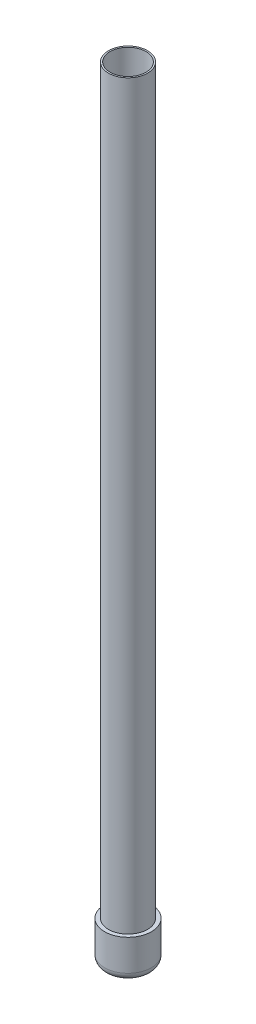
ISO-10303-21;
HEADER;
FILE_DESCRIPTION(('STEP AP214'),'2;1');
FILE_NAME('part.step','',(''),(''),'','','');
FILE_SCHEMA(('AUTOMOTIVE_DESIGN { 1 0 10303 214 1 1 1 1 }'));
ENDSEC;
DATA;
#1=APPLICATION_CONTEXT('core data for automotive mechanical design processes');
#2=APPLICATION_PROTOCOL_DEFINITION('international standard','automotive_design',2000,#1);
#3=PRODUCT_CONTEXT('',#1,'mechanical');
#4=PRODUCT('Part','Part','',(#3));
#5=PRODUCT_RELATED_PRODUCT_CATEGORY('part','',(#4));
#6=PRODUCT_DEFINITION_FORMATION('','',#4);
#7=PRODUCT_DEFINITION_CONTEXT('part definition',#1,'design');
#8=PRODUCT_DEFINITION('design','',#6,#7);
#9=PRODUCT_DEFINITION_SHAPE('','',#8);
#10=(LENGTH_UNIT() NAMED_UNIT(*) SI_UNIT(.MILLI.,.METRE.));
#11=(NAMED_UNIT(*) PLANE_ANGLE_UNIT() SI_UNIT($,.RADIAN.));
#12=(NAMED_UNIT(*) SI_UNIT($,.STERADIAN.) SOLID_ANGLE_UNIT());
#13=UNCERTAINTY_MEASURE_WITH_UNIT(LENGTH_MEASURE(1.E-05),#10,'distance_accuracy_value','');
#14=(GEOMETRIC_REPRESENTATION_CONTEXT(3) GLOBAL_UNCERTAINTY_ASSIGNED_CONTEXT((#13)) GLOBAL_UNIT_ASSIGNED_CONTEXT((#10,
#11,#12)) REPRESENTATION_CONTEXT('',''));
#15=CARTESIAN_POINT('',(0.,0.,0.));
#16=DIRECTION('',(0.,0.,1.));
#17=DIRECTION('',(1.,0.,0.));
#18=AXIS2_PLACEMENT_3D('',#15,#16,#17);
#19=CARTESIAN_POINT('',(0.,500.,0.));
#20=DIRECTION('',(0.,-1.,0.));
#21=DIRECTION('',(0.,0.,-1.));
#22=AXIS2_PLACEMENT_3D('',#19,#20,#21);
#23=CYLINDRICAL_SURFACE('',#22,12.5);
#24=CARTESIAN_POINT('',(0.,500.,0.));
#25=DIRECTION('',(0.,1.,0.));
#26=DIRECTION('',(0.,0.,1.));
#27=AXIS2_PLACEMENT_3D('',#24,#25,#26);
#28=CIRCLE('',#27,12.5);
#29=CARTESIAN_POINT('',(0.,500.,12.5));
#30=VERTEX_POINT('',#29);
#31=EDGE_CURVE('E46',#30,#30,#28,.T.);
#32=ORIENTED_EDGE('',*,*,#31,.F.);
#33=EDGE_LOOP('',(#32));
#34=FACE_BOUND('',#33,.T.);
#35=CARTESIAN_POINT('',(0.,25.,0.));
#36=DIRECTION('',(0.,-1.,0.));
#37=DIRECTION('',(0.,0.,-1.));
#38=AXIS2_PLACEMENT_3D('',#35,#36,#37);
#39=CIRCLE('',#38,12.5);
#40=CARTESIAN_POINT('',(0.,25.,-12.5));
#41=VERTEX_POINT('',#40);
#42=EDGE_CURVE('E42',#41,#41,#39,.T.);
#43=ORIENTED_EDGE('',*,*,#42,.F.);
#44=EDGE_LOOP('',(#43));
#45=FACE_BOUND('',#44,.T.);
#46=ADVANCED_FACE('F31',(#34,#45),#23,.T.);
#47=CARTESIAN_POINT('',(0.,500.,0.));
#48=DIRECTION('',(0.,1.,0.));
#49=DIRECTION('',(0.,0.,1.));
#50=AXIS2_PLACEMENT_3D('',#47,#48,#49);
#51=PLANE('',#50);
#52=CARTESIAN_POINT('',(0.,500.,0.));
#53=DIRECTION('',(0.,1.,0.));
#54=DIRECTION('',(0.,0.,1.));
#55=AXIS2_PLACEMENT_3D('',#52,#53,#54);
#56=CIRCLE('',#55,11.5);
#57=CARTESIAN_POINT('',(0.,500.,11.5));
#58=VERTEX_POINT('',#57);
#59=EDGE_CURVE('E55',#58,#58,#56,.T.);
#60=ORIENTED_EDGE('',*,*,#59,.F.);
#61=EDGE_LOOP('',(#60));
#62=FACE_BOUND('',#61,.T.);
#63=ORIENTED_EDGE('',*,*,#31,.T.);
#64=EDGE_LOOP('',(#63));
#65=FACE_BOUND('',#64,.T.);
#66=ADVANCED_FACE('F90',(#62,#65),#51,.T.);
#67=CARTESIAN_POINT('',(0.,25.,0.));
#68=DIRECTION('',(0.,-1.,0.));
#69=DIRECTION('',(0.,0.,-1.));
#70=AXIS2_PLACEMENT_3D('',#67,#68,#69);
#71=CYLINDRICAL_SURFACE('',#70,15.);
#72=CARTESIAN_POINT('',(0.,5.,0.));
#73=DIRECTION('',(0.,1.,0.));
#74=DIRECTION('',(0.,0.,1.));
#75=AXIS2_PLACEMENT_3D('',#72,#73,#74);
#76=CIRCLE('',#75,15.);
#77=CARTESIAN_POINT('',(0.,5.,15.));
#78=VERTEX_POINT('',#77);
#79=EDGE_CURVE('E10',#78,#78,#76,.T.);
#80=ORIENTED_EDGE('',*,*,#79,.T.);
#81=EDGE_LOOP('',(#80));
#82=FACE_BOUND('',#81,.T.);
#83=CARTESIAN_POINT('',(0.,25.,0.));
#84=DIRECTION('',(0.,-1.,0.));
#85=DIRECTION('',(0.,0.,-1.));
#86=AXIS2_PLACEMENT_3D('',#83,#84,#85);
#87=CIRCLE('',#86,15.);
#88=CARTESIAN_POINT('',(0.,25.,-15.));
#89=VERTEX_POINT('',#88);
#90=EDGE_CURVE('E51',#89,#89,#87,.T.);
#91=ORIENTED_EDGE('',*,*,#90,.T.);
#92=EDGE_LOOP('',(#91));
#93=FACE_BOUND('',#92,.T.);
#94=ADVANCED_FACE('F95',(#82,#93),#71,.T.);
#95=CARTESIAN_POINT('',(0.,25.,0.));
#96=DIRECTION('',(0.,-1.,0.));
#97=DIRECTION('',(0.,0.,-1.));
#98=AXIS2_PLACEMENT_3D('',#95,#96,#97);
#99=PLANE('',#98);
#100=ORIENTED_EDGE('',*,*,#42,.T.);
#101=EDGE_LOOP('',(#100));
#102=FACE_BOUND('',#101,.T.);
#103=ORIENTED_EDGE('',*,*,#90,.F.);
#104=EDGE_LOOP('',(#103));
#105=FACE_BOUND('',#104,.T.);
#106=ADVANCED_FACE('F103',(#102,#105),#99,.F.);
#107=CARTESIAN_POINT('',(0.,0.,0.));
#108=DIRECTION('',(0.,1.,0.));
#109=DIRECTION('',(0.,0.,1.));
#110=AXIS2_PLACEMENT_3D('',#107,#108,#109);
#111=PLANE('',#110);
#112=CARTESIAN_POINT('',(0.,0.,0.));
#113=DIRECTION('',(0.,1.,0.));
#114=DIRECTION('',(0.,0.,1.));
#115=AXIS2_PLACEMENT_3D('',#112,#113,#114);
#116=CIRCLE('',#115,10.);
#117=CARTESIAN_POINT('',(0.,0.,10.));
#118=VERTEX_POINT('',#117);
#119=EDGE_CURVE('E38',#118,#118,#116,.F.);
#120=ORIENTED_EDGE('',*,*,#119,.T.);
#121=EDGE_LOOP('',(#120));
#122=FACE_BOUND('',#121,.T.);
#123=ADVANCED_FACE('F101',(#122),#111,.F.);
#124=CARTESIAN_POINT('',(0.,5.,0.));
#125=DIRECTION('',(0.,1.,0.));
#126=DIRECTION('',(0.,0.,1.));
#127=AXIS2_PLACEMENT_3D('',#124,#125,#126);
#128=TOROIDAL_SURFACE('',#127,10.,5.);
#129=ORIENTED_EDGE('',*,*,#79,.F.);
#130=EDGE_LOOP('',(#129));
#131=FACE_BOUND('',#130,.T.);
#132=ORIENTED_EDGE('',*,*,#119,.F.);
#133=EDGE_LOOP('',(#132));
#134=FACE_BOUND('',#133,.T.);
#135=ADVANCED_FACE('F33',(#131,#134),#128,.T.);
#136=CARTESIAN_POINT('',(0.,500.,0.));
#137=DIRECTION('',(0.,-1.,0.));
#138=DIRECTION('',(0.,0.,-1.));
#139=AXIS2_PLACEMENT_3D('',#136,#137,#138);
#140=CYLINDRICAL_SURFACE('',#139,11.5);
#141=ORIENTED_EDGE('',*,*,#59,.T.);
#142=EDGE_LOOP('',(#141));
#143=FACE_BOUND('',#142,.T.);
#144=CARTESIAN_POINT('',(0.,24.,0.));
#145=DIRECTION('',(0.,-1.,0.));
#146=DIRECTION('',(0.,0.,-1.));
#147=AXIS2_PLACEMENT_3D('',#144,#145,#146);
#148=CIRCLE('',#147,11.5);
#149=CARTESIAN_POINT('',(0.,24.,-11.5));
#150=VERTEX_POINT('',#149);
#151=EDGE_CURVE('E58',#150,#150,#148,.T.);
#152=ORIENTED_EDGE('',*,*,#151,.T.);
#153=EDGE_LOOP('',(#152));
#154=FACE_BOUND('',#153,.T.);
#155=ADVANCED_FACE('F70',(#143,#154),#140,.F.);
#156=CARTESIAN_POINT('',(0.,25.,0.));
#157=DIRECTION('',(0.,-1.,0.));
#158=DIRECTION('',(0.,0.,-1.));
#159=AXIS2_PLACEMENT_3D('',#156,#157,#158);
#160=CYLINDRICAL_SURFACE('',#159,14.);
#161=CARTESIAN_POINT('',(0.,5.,0.));
#162=DIRECTION('',(0.,-1.,0.));
#163=DIRECTION('',(0.,0.,-1.));
#164=AXIS2_PLACEMENT_3D('',#161,#162,#163);
#165=CIRCLE('',#164,14.);
#166=CARTESIAN_POINT('',(0.,5.,-14.));
#167=VERTEX_POINT('',#166);
#168=EDGE_CURVE('E54',#167,#167,#165,.F.);
#169=ORIENTED_EDGE('',*,*,#168,.F.);
#170=EDGE_LOOP('',(#169));
#171=FACE_BOUND('',#170,.T.);
#172=CARTESIAN_POINT('',(0.,24.,0.));
#173=DIRECTION('',(0.,-1.,0.));
#174=DIRECTION('',(0.,0.,-1.));
#175=AXIS2_PLACEMENT_3D('',#172,#173,#174);
#176=CIRCLE('',#175,14.);
#177=CARTESIAN_POINT('',(0.,24.,-14.));
#178=VERTEX_POINT('',#177);
#179=EDGE_CURVE('E59',#178,#178,#176,.T.);
#180=ORIENTED_EDGE('',*,*,#179,.F.);
#181=EDGE_LOOP('',(#180));
#182=FACE_BOUND('',#181,.T.);
#183=ADVANCED_FACE('F76',(#171,#182),#160,.F.);
#184=CARTESIAN_POINT('',(0.,24.,0.));
#185=DIRECTION('',(0.,-1.,0.));
#186=DIRECTION('',(0.,0.,-1.));
#187=AXIS2_PLACEMENT_3D('',#184,#185,#186);
#188=PLANE('',#187);
#189=ORIENTED_EDGE('',*,*,#151,.F.);
#190=EDGE_LOOP('',(#189));
#191=FACE_BOUND('',#190,.T.);
#192=ORIENTED_EDGE('',*,*,#179,.T.);
#193=EDGE_LOOP('',(#192));
#194=FACE_BOUND('',#193,.T.);
#195=ADVANCED_FACE('F72',(#191,#194),#188,.T.);
#196=CARTESIAN_POINT('',(0.,1.,0.));
#197=DIRECTION('',(0.,1.,0.));
#198=DIRECTION('',(0.,0.,1.));
#199=AXIS2_PLACEMENT_3D('',#196,#197,#198);
#200=PLANE('',#199);
#201=CARTESIAN_POINT('',(0.,1.,0.));
#202=DIRECTION('',(0.,1.,0.));
#203=DIRECTION('',(0.,0.,1.));
#204=AXIS2_PLACEMENT_3D('',#201,#202,#203);
#205=CIRCLE('',#204,10.);
#206=CARTESIAN_POINT('',(0.,1.,10.));
#207=VERTEX_POINT('',#206);
#208=EDGE_CURVE('E60',#207,#207,#205,.F.);
#209=ORIENTED_EDGE('',*,*,#208,.F.);
#210=EDGE_LOOP('',(#209));
#211=FACE_BOUND('',#210,.T.);
#212=ADVANCED_FACE('F75',(#211),#200,.T.);
#213=CARTESIAN_POINT('',(0.,5.,0.));
#214=DIRECTION('',(0.,1.,0.));
#215=DIRECTION('',(0.,0.,1.));
#216=AXIS2_PLACEMENT_3D('',#213,#214,#215);
#217=TOROIDAL_SURFACE('',#216,10.,4.);
#218=ORIENTED_EDGE('',*,*,#168,.T.);
#219=EDGE_LOOP('',(#218));
#220=FACE_BOUND('',#219,.T.);
#221=ORIENTED_EDGE('',*,*,#208,.T.);
#222=EDGE_LOOP('',(#221));
#223=FACE_BOUND('',#222,.T.);
#224=ADVANCED_FACE('F110',(#220,#223),#217,.F.);
#225=CLOSED_SHELL('',(#46,#66,#94,#106,#123,#135,#155,#183,#195,#212,#224));
#226=MANIFOLD_SOLID_BREP('B2',#225);
#227=ADVANCED_BREP_SHAPE_REPRESENTATION('',(#18,#226),#14);
#228=SHAPE_DEFINITION_REPRESENTATION(#9,#227);
ENDSEC;
END-ISO-10303-21;
